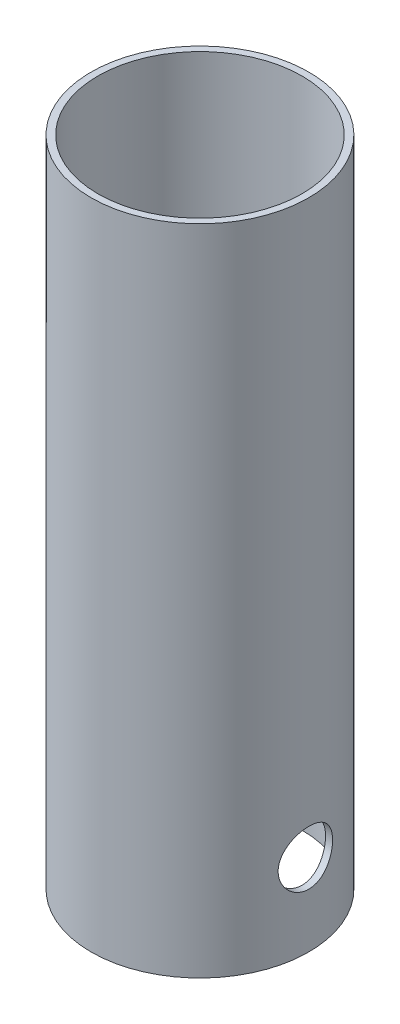
ISO-10303-21;
HEADER;
FILE_DESCRIPTION(('STEP AP214'),'2;1');
FILE_NAME('part.step','',(''),(''),'','','');
FILE_SCHEMA(('AUTOMOTIVE_DESIGN { 1 0 10303 214 1 1 1 1 }'));
ENDSEC;
DATA;
#1=APPLICATION_CONTEXT('core data for automotive mechanical design processes');
#2=APPLICATION_PROTOCOL_DEFINITION('international standard','automotive_design',2000,#1);
#3=PRODUCT_CONTEXT('',#1,'mechanical');
#4=PRODUCT('Part','Part','',(#3));
#5=PRODUCT_RELATED_PRODUCT_CATEGORY('part','',(#4));
#6=PRODUCT_DEFINITION_FORMATION('','',#4);
#7=PRODUCT_DEFINITION_CONTEXT('part definition',#1,'design');
#8=PRODUCT_DEFINITION('design','',#6,#7);
#9=PRODUCT_DEFINITION_SHAPE('','',#8);
#10=(LENGTH_UNIT() NAMED_UNIT(*) SI_UNIT(.MILLI.,.METRE.));
#11=(NAMED_UNIT(*) PLANE_ANGLE_UNIT() SI_UNIT($,.RADIAN.));
#12=(NAMED_UNIT(*) SI_UNIT($,.STERADIAN.) SOLID_ANGLE_UNIT());
#13=UNCERTAINTY_MEASURE_WITH_UNIT(LENGTH_MEASURE(1.E-05),#10,'distance_accuracy_value','');
#14=(GEOMETRIC_REPRESENTATION_CONTEXT(3) GLOBAL_UNCERTAINTY_ASSIGNED_CONTEXT((#13)) GLOBAL_UNIT_ASSIGNED_CONTEXT((#10,
#11,#12)) REPRESENTATION_CONTEXT('',''));
#15=CARTESIAN_POINT('',(0.,0.,0.));
#16=DIRECTION('',(0.,0.,1.));
#17=DIRECTION('',(1.,0.,0.));
#18=AXIS2_PLACEMENT_3D('',#15,#16,#17);
#19=CARTESIAN_POINT('',(0.,304.8,0.));
#20=DIRECTION('',(0.,-1.,0.));
#21=DIRECTION('',(0.,0.,-1.));
#22=AXIS2_PLACEMENT_3D('',#19,#20,#21);
#23=CYLINDRICAL_SURFACE('',#22,50.8);
#24=CARTESIAN_POINT('',(0.,304.8,0.));
#25=DIRECTION('',(0.,1.,0.));
#26=DIRECTION('',(0.,0.,1.));
#27=AXIS2_PLACEMENT_3D('',#24,#25,#26);
#28=CIRCLE('',#27,50.8);
#29=CARTESIAN_POINT('',(0.,304.8,50.8));
#30=VERTEX_POINT('',#29);
#31=EDGE_CURVE('E10',#30,#30,#28,.T.);
#32=ORIENTED_EDGE('',*,*,#31,.F.);
#33=EDGE_LOOP('',(#32));
#34=FACE_BOUND('',#33,.T.);
#35=CARTESIAN_POINT('',(0.,0.,0.));
#36=DIRECTION('',(0.,1.,0.));
#37=DIRECTION('',(0.,0.,1.));
#38=AXIS2_PLACEMENT_3D('',#35,#36,#37);
#39=CIRCLE('',#38,50.8);
#40=CARTESIAN_POINT('',(0.,0.,50.8));
#41=VERTEX_POINT('',#40);
#42=EDGE_CURVE('E44',#41,#41,#39,.T.);
#43=ORIENTED_EDGE('',*,*,#42,.T.);
#44=EDGE_LOOP('',(#43));
#45=FACE_BOUND('',#44,.T.);
#46=CARTESIAN_POINT('',(50.8,25.4,0.));
#47=CARTESIAN_POINT('',(50.7999991712333,25.4000014808444,-0.350871391860034));
#48=CARTESIAN_POINT('',(50.7963557889345,25.4145529083914,-0.701772516317838));
#49=CARTESIAN_POINT('',(50.7818809426384,25.4726405010329,-1.40104048403797));
#50=CARTESIAN_POINT('',(50.7710486585199,25.5161799731303,-1.74940703356745));
#51=CARTESIAN_POINT('',(50.7424895295911,25.6319052223682,-2.44124502263754));
#52=CARTESIAN_POINT('',(50.7247591873977,25.7041055312119,-2.78471388728348));
#53=CARTESIAN_POINT('',(50.6828935871675,25.8765516415089,-3.46412270465078));
#54=CARTESIAN_POINT('',(50.6587584928528,25.976796726068,-3.80006284958783));
#55=CARTESIAN_POINT('',(50.6047757406586,26.2043905326087,-4.46169451021718));
#56=CARTESIAN_POINT('',(50.5749350623246,26.3317061607503,-4.78739798722229));
#57=CARTESIAN_POINT('',(50.5103272300051,26.6125364293402,-5.42679543621999));
#58=CARTESIAN_POINT('',(50.4755600499304,26.7660512085315,-5.74048934460267));
#59=CARTESIAN_POINT('',(50.4020285790165,27.0981504495676,-6.35381147979076));
#60=CARTESIAN_POINT('',(50.3632643460531,27.2767345484323,-6.65343991016729));
#61=CARTESIAN_POINT('',(50.2827640986144,27.6577289740211,-7.2367349743611));
#62=CARTESIAN_POINT('',(50.2410279532313,27.8601403505552,-7.5204009040695));
#63=CARTESIAN_POINT('',(50.1548966889806,28.2913759349972,-8.0750581156447));
#64=CARTESIAN_POINT('',(50.1104666867623,28.5206191069139,-8.34571831903796));
#65=CARTESIAN_POINT('',(50.020881989898,29.0008641477497,-8.86686464210652));
#66=CARTESIAN_POINT('',(49.9757272866935,29.2518662737918,-9.11735052331669));
#67=CARTESIAN_POINT('',(49.8859289931922,29.774013811754,-9.59653750577761));
#68=CARTESIAN_POINT('',(49.8412854668862,30.0451617144521,-9.82523590526958));
#69=CARTESIAN_POINT('',(49.7537567109945,30.6058053123866,-10.2592748828875));
#70=CARTESIAN_POINT('',(49.7108714359826,30.8953005331093,-10.4646160647139));
#71=CARTESIAN_POINT('',(49.6274495248504,31.4952088921253,-10.8534044313296));
#72=CARTESIAN_POINT('',(49.5869574423395,31.8058695650575,-11.0364795147975));
#73=CARTESIAN_POINT('',(49.5102280325956,32.4420524126483,-11.3757455186293));
#74=CARTESIAN_POINT('',(49.4739907590757,32.7675747748501,-11.5319360996125));
#75=CARTESIAN_POINT('',(49.4068725050042,33.4311693111948,-11.8161875968753));
#76=CARTESIAN_POINT('',(49.375990858258,33.7692399180816,-11.944252012341));
#77=CARTESIAN_POINT('',(49.3205348605853,34.4555366388717,-12.1712162815549));
#78=CARTESIAN_POINT('',(49.2959603585794,34.8037625092967,-12.2701168338931));
#79=CARTESIAN_POINT('',(49.2543154217642,35.5007386966448,-12.436221348795));
#80=CARTESIAN_POINT('',(49.2371045464795,35.8493388151985,-12.5040204866511));
#81=CARTESIAN_POINT('',(49.210015019444,36.5512729679229,-12.6102115178838));
#82=CARTESIAN_POINT('',(49.2001362788037,36.9046069446509,-12.6486037677684));
#83=CARTESIAN_POINT('',(49.1880202031264,37.6133300613739,-12.6956394461546));
#84=CARTESIAN_POINT('',(49.1857817831568,37.9687189023965,-12.7042870984177));
#85=CARTESIAN_POINT('',(49.1890137301876,38.6789330651642,-12.691767865219));
#86=CARTESIAN_POINT('',(49.1944839899993,39.0337583946762,-12.6706013943201));
#87=CARTESIAN_POINT('',(49.2127364224763,39.7316073960973,-12.5995187524157));
#88=CARTESIAN_POINT('',(49.22533786105,40.0747084533623,-12.5503130079523));
#89=CARTESIAN_POINT('',(49.2573417276894,40.7554296627482,-12.4241103292504));
#90=CARTESIAN_POINT('',(49.2767440292335,41.0930499167103,-12.3471139120216));
#91=CARTESIAN_POINT('',(49.3217843433286,41.7605053161526,-12.1659479686147));
#92=CARTESIAN_POINT('',(49.3474226602481,42.0903400807747,-12.0617771160834));
#93=CARTESIAN_POINT('',(49.4041992420618,42.7400033848484,-11.8270732469111));
#94=CARTESIAN_POINT('',(49.4353375935764,43.0598317666152,-11.6965398150795));
#95=CARTESIAN_POINT('',(49.5025763638362,43.690562937089,-11.4086367411141));
#96=CARTESIAN_POINT('',(49.5387236163962,44.0013433300195,-11.2510099645166));
#97=CARTESIAN_POINT('',(49.6147222499585,44.6085650971434,-10.9109884297951));
#98=CARTESIAN_POINT('',(49.6545736446387,44.9050064183824,-10.7285935802116));
#99=CARTESIAN_POINT('',(49.7368912061636,45.4817227687305,-10.3402629377576));
#100=CARTESIAN_POINT('',(49.7793577545136,45.7619954275077,-10.1343237064006));
#101=CARTESIAN_POINT('',(49.8657540468829,46.3045828394129,-9.70028478733842));
#102=CARTESIAN_POINT('',(49.9096838191885,46.5668972450812,-9.47218467106647));
#103=CARTESIAN_POINT('',(49.9990956144951,47.0791412455607,-8.98847184260351));
#104=CARTESIAN_POINT('',(50.0445861548595,47.3285036662773,-8.73225969013431));
#105=CARTESIAN_POINT('',(50.134608462289,47.8048276343791,-8.19963228506236));
#106=CARTESIAN_POINT('',(50.179140210607,48.0317887440657,-7.92321663788773));
#107=CARTESIAN_POINT('',(50.2660084708923,48.4617544054244,-7.35199551908321));
#108=CARTESIAN_POINT('',(50.3083448968907,48.6647580193183,-7.05718932827454));
#109=CARTESIAN_POINT('',(50.3896420078925,49.0453458083086,-6.45115747378643));
#110=CARTESIAN_POINT('',(50.4286027134811,49.2229301384173,-6.13993191025174));
#111=CARTESIAN_POINT('',(50.5021857009727,49.5519242435077,-5.50205894817664));
#112=CARTESIAN_POINT('',(50.5367924694725,49.7032411142655,-5.1753618122226));
#113=CARTESIAN_POINT('',(50.6005250900631,49.9777512654891,-4.50983291281435));
#114=CARTESIAN_POINT('',(50.6296509113616,50.1009443879536,-4.17100108119895));
#115=CARTESIAN_POINT('',(50.6815804451279,50.3181720049987,-3.48369689795437));
#116=CARTESIAN_POINT('',(50.7043851415043,50.4122110378009,-3.13522605597325));
#117=CARTESIAN_POINT('',(50.7430158052577,50.5703465148879,-2.43117683531056));
#118=CARTESIAN_POINT('',(50.7588419446875,50.6344436973761,-2.07559863208339));
#119=CARTESIAN_POINT('',(50.7827431029274,50.7308795801196,-1.36919301852314));
#120=CARTESIAN_POINT('',(50.7910062049692,50.7639893989506,-1.01847707073284));
#121=CARTESIAN_POINT('',(50.800237198679,50.8009615432285,-0.31541336743784));
#122=CARTESIAN_POINT('',(50.8012052148024,50.8048243676347,0.0369343601257747));
#123=CARTESIAN_POINT('',(50.7958191948714,50.7832706554038,0.740645926180684));
#124=CARTESIAN_POINT('',(50.7894657659043,50.7578565463831,1.09200984382704));
#125=CARTESIAN_POINT('',(50.7696157024385,50.6779717279862,1.79121253860491));
#126=CARTESIAN_POINT('',(50.7561190958689,50.623501132218,2.13905132951393));
#127=CARTESIAN_POINT('',(50.7226101245245,50.4869883349046,2.82356306179158));
#128=CARTESIAN_POINT('',(50.702697527001,50.4053677184755,3.16032511359436));
#129=CARTESIAN_POINT('',(50.6568399111438,50.2150301012709,3.82567304882496));
#130=CARTESIAN_POINT('',(50.630894970696,50.1063134503419,4.15425903775662));
#131=CARTESIAN_POINT('',(50.5736595563104,49.862612838819,4.80108255615767));
#132=CARTESIAN_POINT('',(50.5423686884254,49.7276269423137,5.1193193209228));
#133=CARTESIAN_POINT('',(50.4752652454366,49.4323897300467,5.74335228440324));
#134=CARTESIAN_POINT('',(50.4394525868554,49.2721379478339,6.04914825330924));
#135=CARTESIAN_POINT('',(50.3635709449454,48.9244427345385,6.65165784868683));
#136=CARTESIAN_POINT('',(50.3234377307047,48.7365673976428,6.94811415662722));
#137=CARTESIAN_POINT('',(50.2405291461286,48.3371345740729,7.52422380225494));
#138=CARTESIAN_POINT('',(50.1977537501503,48.1255768575398,7.80387697681214));
#139=CARTESIAN_POINT('',(50.1106965473362,47.6801672244722,8.34464614432663));
#140=CARTESIAN_POINT('',(50.0664145124361,47.4463119229455,8.60575931219814));
#141=CARTESIAN_POINT('',(49.9775345625901,46.9578564600255,9.10774552124841));
#142=CARTESIAN_POINT('',(49.9329366440753,46.7032560639181,9.34861833336123));
#143=CARTESIAN_POINT('',(49.8435396380995,46.1684342909757,9.81423152077404));
#144=CARTESIAN_POINT('',(49.798762552455,45.8877369638548,10.0384298094841));
#145=CARTESIAN_POINT('',(49.7114180474332,45.3081305675814,10.4623983928031));
#146=CARTESIAN_POINT('',(49.6688506683881,45.0092211662326,10.6621682416265));
#147=CARTESIAN_POINT('',(49.5871654525083,44.3951999074534,11.0358331435241));
#148=CARTESIAN_POINT('',(49.5480475348876,44.0800884297478,11.2097288026349));
#149=CARTESIAN_POINT('',(49.4744221827737,43.4358078663221,11.5303347640473));
#150=CARTESIAN_POINT('',(49.4399146841434,43.1066389762436,11.6770454445395));
#151=CARTESIAN_POINT('',(49.3767472758478,42.4385568552869,11.941322821957));
#152=CARTESIAN_POINT('',(49.3480535235023,42.0997139390627,12.0590590982579));
#153=CARTESIAN_POINT('',(49.2971353347031,41.4128290431708,12.2655522066121));
#154=CARTESIAN_POINT('',(49.2749108891826,41.0647870763963,12.3543090792797));
#155=CARTESIAN_POINT('',(49.2376296473392,40.3621281676378,12.5020654961983));
#156=CARTESIAN_POINT('',(49.2225715358236,40.0075124445152,12.561070500742));
#157=CARTESIAN_POINT('',(49.2000953577878,39.2943190214301,12.6488212395504));
#158=CARTESIAN_POINT('',(49.1926771074559,38.9357414169985,12.6775677018221));
#159=CARTESIAN_POINT('',(49.185817071215,38.2277016124864,12.7041557199839));
#160=CARTESIAN_POINT('',(49.1861520762816,37.8782737577217,12.7028620982897));
#161=CARTESIAN_POINT('',(49.1942408132605,37.18080332814,12.6715008474905));
#162=CARTESIAN_POINT('',(49.2019943950572,36.8327607254354,12.6414338006184));
#163=CARTESIAN_POINT('',(49.2246856842026,36.1405766915761,12.5527847539515));
#164=CARTESIAN_POINT('',(49.2396232005249,35.796435156938,12.4942035123705));
#165=CARTESIAN_POINT('',(49.2762353693013,35.114482716169,12.3490170971842));
#166=CARTESIAN_POINT('',(49.2979100555285,34.7766718417825,12.2624117830954));
#167=CARTESIAN_POINT('',(49.3472093404805,34.1117220151869,12.0624812258991));
#168=CARTESIAN_POINT('',(49.3747975356246,33.7845312738811,11.9493190796123));
#169=CARTESIAN_POINT('',(49.4352104919493,33.1408966925127,11.6968711757633));
#170=CARTESIAN_POINT('',(49.4680352156121,32.8244527754727,11.5575856053645));
#171=CARTESIAN_POINT('',(49.5380063997145,32.2043218512767,11.253896671366));
#172=CARTESIAN_POINT('',(49.5751532777759,31.9006360807229,11.08949088008));
#173=CARTESIAN_POINT('',(49.6527498425637,31.3079530011093,10.7367145243406));
#174=CARTESIAN_POINT('',(49.6931996654691,31.0189562984709,10.5483429716106));
#175=CARTESIAN_POINT('',(49.7773998737371,30.4501161769564,10.1436809712847));
#176=CARTESIAN_POINT('',(49.8212088308342,30.1707081570843,9.92679043665087));
#177=CARTESIAN_POINT('',(49.9099422721471,29.6310449754774,9.4705676224956));
#178=CARTESIAN_POINT('',(49.9548667762613,29.3707901557157,9.23123494245163));
#179=CARTESIAN_POINT('',(50.0445985397535,28.8711179777936,8.73169734920666));
#180=CARTESIAN_POINT('',(50.0894057976671,28.6317008786965,8.47149217658717));
#181=CARTESIAN_POINT('',(50.1777009283588,28.1751897463363,7.93177910675604));
#182=CARTESIAN_POINT('',(50.2211882192745,27.9581054598087,7.65226286980275));
#183=CARTESIAN_POINT('',(50.3064080167936,27.5441260892629,7.07059087046114));
#184=CARTESIAN_POINT('',(50.3480942908494,27.3476694360361,6.76811606417608));
#185=CARTESIAN_POINT('',(50.4276548019764,26.9810799090292,6.14731636447359));
#186=CARTESIAN_POINT('',(50.4655307342998,26.8109353105372,5.8289986147784));
#187=CARTESIAN_POINT('',(50.5364004586039,26.4982345452317,5.17872119105971));
#188=CARTESIAN_POINT('',(50.5693961638392,26.3556675600479,4.84676692868837));
#189=CARTESIAN_POINT('',(50.6295721583139,26.0992026348734,4.17148182323261));
#190=CARTESIAN_POINT('',(50.6567533247305,25.9853003700849,3.82815270518897));
#191=CARTESIAN_POINT('',(50.7000132858145,25.8057979368553,3.19823683200796));
#192=CARTESIAN_POINT('',(50.71721910594,25.7351397987874,2.91315649544672));
#193=CARTESIAN_POINT('',(50.7469593206541,25.6137132702994,2.33855715066218));
#194=CARTESIAN_POINT('',(50.759494041119,25.5629434923679,2.04903845354596));
#195=CARTESIAN_POINT('',(50.7796492224325,25.4815876252073,1.46697993465224));
#196=CARTESIAN_POINT('',(50.7872692100114,25.4510034797697,1.17443982467946));
#197=CARTESIAN_POINT('',(50.7974442950098,25.4102116657456,0.587939844327169));
#198=CARTESIAN_POINT('',(50.8000006943887,25.3999987592629,0.293980358391877));
#199=CARTESIAN_POINT('',(50.8,25.4,0.));
#200=B_SPLINE_CURVE_WITH_KNOTS('',3,(#46,#47,#48,#49,#50,#51,#52,#53,#54,#55,#56,#57,#58,#59,
#60,#61,#62,#63,#64,#65,#66,#67,#68,#69,#70,#71,#72,#73,#74,#75,#76,#77,#78,#79,#80,#81,#82,#83,
#84,#85,#86,#87,#88,#89,#90,#91,#92,#93,#94,#95,#96,#97,#98,#99,#100,#101,#102,#103,#104,#105,
#106,#107,#108,#109,#110,#111,#112,#113,#114,#115,#116,#117,#118,#119,#120,#121,#122,#123,#124,
#125,#126,#127,#128,#129,#130,#131,#132,#133,#134,#135,#136,#137,#138,#139,#140,#141,#142,#143,
#144,#145,#146,#147,#148,#149,#150,#151,#152,#153,#154,#155,#156,#157,#158,#159,#160,#161,#162,
#163,#164,#165,#166,#167,#168,#169,#170,#171,#172,#173,#174,#175,#176,#177,#178,#179,#180,#181,
#182,#183,#184,#185,#186,#187,#188,#189,#190,#191,#192,#193,#194,#195,#196,#197,#198,#199),
.UNSPECIFIED.,.T.,.F.,(4,2,2,2,2,2,2,2,2,2,2,2,2,2,2,2,2,2,2,2,2,2,2,2,2,2,2,2,2,2,2,2,2,2,2,2,
2,2,2,2,2,2,2,2,2,2,2,2,2,2,2,2,2,2,2,2,2,2,2,2,2,2,2,2,2,2,2,2,2,2,2,2,2,2,2,2,4),(0.,
1.05234624346945,2.10481256086917,3.15781318586586,4.21078689601292,5.26248066800091,
6.314180009622,7.36586412519272,8.41759459443973,9.48875995810055,10.5599379813243,
11.6312486636515,12.7025316501414,13.7897879560629,14.8770579861276,15.9641926718257,
17.0513013142289,18.1166362841097,19.1819583384339,20.2471291097522,21.3122850701071,
22.3515824133506,23.3908604227986,24.4301891677163,25.4695342825529,26.5193512082967,
27.5691720107417,28.6191463282366,29.6691409551005,30.749104279285,31.8290887006652,
32.9091153823177,33.989135477451,35.0729008874254,36.1566723859189,37.2402750961568,
38.3238510892192,39.3796834211881,40.4354977404137,41.4912245187902,42.5469471694054,
43.5869874640297,44.6270143310167,45.6671178717933,46.7072406168912,47.7658131283218,
48.8243959150497,49.8831396616753,50.9418953887957,52.0266761501365,53.1114767042888,
54.196251845764,55.2810118949809,56.3592635004122,57.4375135946802,58.5155657280672,
59.5935919234102,60.6406223926115,61.6876316755096,62.7346131191635,63.7815998113718,
64.8223174281643,65.8630275889357,66.9038383904497,67.9446921258183,69.012696289142,
70.0807195166508,71.148756020385,72.2172566885489,73.305169077625,74.3925952848531,
75.4795940387079,76.5664286928594,77.44834870663,78.3302071822974,79.2121505648429,
80.09386715099),.UNSPECIFIED.);
#201=CARTESIAN_POINT('',(50.8,25.4,0.));
#202=VERTEX_POINT('',#201);
#203=EDGE_CURVE('E54',#202,#202,#200,.T.);
#204=ORIENTED_EDGE('',*,*,#203,.F.);
#205=EDGE_LOOP('',(#204));
#206=FACE_BOUND('',#205,.T.);
#207=ADVANCED_FACE('F31',(#34,#45,#206),#23,.T.);
#208=CARTESIAN_POINT('',(0.,304.8,0.));
#209=DIRECTION('',(0.,-1.,0.));
#210=DIRECTION('',(0.,0.,-1.));
#211=AXIS2_PLACEMENT_3D('',#208,#209,#210);
#212=CYLINDRICAL_SURFACE('',#211,47.625);
#213=CARTESIAN_POINT('',(0.,0.,0.));
#214=DIRECTION('',(0.,1.,0.));
#215=DIRECTION('',(0.,0.,1.));
#216=AXIS2_PLACEMENT_3D('',#213,#214,#215);
#217=CIRCLE('',#216,47.625);
#218=CARTESIAN_POINT('',(0.,0.,47.625));
#219=VERTEX_POINT('',#218);
#220=EDGE_CURVE('E51',#219,#219,#217,.T.);
#221=ORIENTED_EDGE('',*,*,#220,.F.);
#222=EDGE_LOOP('',(#221));
#223=FACE_BOUND('',#222,.T.);
#224=CARTESIAN_POINT('',(0.,304.8,0.));
#225=DIRECTION('',(0.,1.,0.));
#226=DIRECTION('',(0.,0.,1.));
#227=AXIS2_PLACEMENT_3D('',#224,#225,#226);
#228=CIRCLE('',#227,47.625);
#229=CARTESIAN_POINT('',(0.,304.8,47.625));
#230=VERTEX_POINT('',#229);
#231=EDGE_CURVE('E49',#230,#230,#228,.T.);
#232=ORIENTED_EDGE('',*,*,#231,.T.);
#233=EDGE_LOOP('',(#232));
#234=FACE_BOUND('',#233,.T.);
#235=CARTESIAN_POINT('',(45.900442535993,38.1,12.7));
#236=CARTESIAN_POINT('',(45.9004433753251,37.7501668357476,12.699998727167));
#237=CARTESIAN_POINT('',(45.9044528486738,37.4003093505592,12.6855329845805));
#238=CARTESIAN_POINT('',(45.9203695596393,36.7031434131365,12.627793341495));
#239=CARTESIAN_POINT('',(45.9322775357287,36.3558352023174,12.5845167473159));
#240=CARTESIAN_POINT('',(45.9636326456536,35.6661499473453,12.4695087162927));
#241=CARTESIAN_POINT('',(45.9830831324684,35.323775166624,12.3977646240576));
#242=CARTESIAN_POINT('',(46.0289339843067,34.6465543851171,12.2264349792985));
#243=CARTESIAN_POINT('',(46.0553342160743,34.3117082401093,12.1268499606006));
#244=CARTESIAN_POINT('',(46.1142587773997,33.6523113839474,11.9008138352313));
#245=CARTESIAN_POINT('',(46.1467743040132,33.3277466478549,11.7744013134764));
#246=CARTESIAN_POINT('',(46.2170137284818,32.6905619548832,11.4956042793671));
#247=CARTESIAN_POINT('',(46.2547376462459,32.3779420436688,11.3432196677338));
#248=CARTESIAN_POINT('',(46.3343241857379,31.766691066583,11.0136166280315));
#249=CARTESIAN_POINT('',(46.3761862699041,31.4680581911573,10.8364014242944));
#250=CARTESIAN_POINT('',(46.4629153744157,30.8864987267665,10.4582858445935));
#251=CARTESIAN_POINT('',(46.5077834604895,30.6035777739177,10.2573770490591));
#252=CARTESIAN_POINT('',(46.6003284541004,30.0491381662359,9.82848909309138));
#253=CARTESIAN_POINT('',(46.6480457929485,29.7780176886164,9.60000375906029));
#254=CARTESIAN_POINT('',(46.7440201307412,29.2558680893888,9.12122810525689));
#255=CARTESIAN_POINT('',(46.7922771362818,29.0048392136534,8.87093751871911));
#256=CARTESIAN_POINT('',(46.8880216752852,28.5244381073913,8.35009946091211));
#257=CARTESIAN_POINT('',(46.9355089907486,28.2950719265748,8.07954636856195));
#258=CARTESIAN_POINT('',(47.0283891862403,27.8596877254844,7.52007989004957));
#259=CARTESIAN_POINT('',(47.0737827925313,27.6536615723927,7.23117295438042));
#260=CARTESIAN_POINT('',(47.1619672597062,27.2631502786409,6.63194124111976));
#261=CARTESIAN_POINT('',(47.2047038624532,27.0790694223953,6.32134478160254));
#262=CARTESIAN_POINT('',(47.2855450695882,26.7377975699352,5.6851266717823));
#263=CARTESIAN_POINT('',(47.3236496094203,26.5806069484699,5.35950481216168));
#264=CARTESIAN_POINT('',(47.3941325942815,26.2943900406393,4.69555533434485));
#265=CARTESIAN_POINT('',(47.4265117851343,26.165360085356,4.35722937804418));
#266=CARTESIAN_POINT('',(47.4846130571243,25.9365254900323,3.67027840325549));
#267=CARTESIAN_POINT('',(47.5103353153119,25.8367200727157,3.32165365895277));
#268=CARTESIAN_POINT('',(47.5538666226843,25.6691512003179,2.62478016401492));
#269=CARTESIAN_POINT('',(47.5718434368499,25.6007061539759,2.27670572151941));
#270=CARTESIAN_POINT('',(47.600217089759,25.4931470910911,1.5757474086248));
#271=CARTESIAN_POINT('',(47.6106140333278,25.4540326689223,1.2228636048052));
#272=CARTESIAN_POINT('',(47.623531326378,25.4054870202205,0.514967692435199));
#273=CARTESIAN_POINT('',(47.6260528208849,25.3960514786212,0.159955900797415));
#274=CARTESIAN_POINT('',(47.6231503059244,25.4069369591472,-0.549575854092063));
#275=CARTESIAN_POINT('',(47.6177264096257,25.427257557446,-0.90409582427694));
#276=CARTESIAN_POINT('',(47.5993244182808,25.4965823365938,-1.60106088073403));
#277=CARTESIAN_POINT('',(47.5865406048655,25.5448489975603,-1.9435847695569));
#278=CARTESIAN_POINT('',(47.5539174306413,25.6690697729616,-2.62322426893063));
#279=CARTESIAN_POINT('',(47.5340782090768,25.7450233409725,-2.96033998607913));
#280=CARTESIAN_POINT('',(47.4878737004713,25.9239994129397,-3.62685633364968));
#281=CARTESIAN_POINT('',(47.4615081871182,26.0270228556045,-3.95625669609298));
#282=CARTESIAN_POINT('',(47.4029486572298,26.2593268088103,-4.60512915127636));
#283=CARTESIAN_POINT('',(47.3707545486427,26.3886077340429,-4.92460108712216));
#284=CARTESIAN_POINT('',(47.301035373617,26.6738619573257,-5.55464997788189));
#285=CARTESIAN_POINT('',(47.2634606115473,26.8300872220722,-5.86510731936137));
#286=CARTESIAN_POINT('',(47.1842159006326,27.1671855006563,-6.47178456843374));
#287=CARTESIAN_POINT('',(47.1425459376928,27.3480585993268,-6.76800442701928));
#288=CARTESIAN_POINT('',(47.0561937261027,27.7332280359162,-7.3443995433079));
#289=CARTESIAN_POINT('',(47.0115110243342,27.9375279004902,-7.62457237575423));
#290=CARTESIAN_POINT('',(46.9203004047879,28.3681840160222,-8.16711219720706));
#291=CARTESIAN_POINT('',(46.8737724052215,28.5945412452723,-8.42947839557425));
#292=CARTESIAN_POINT('',(46.7786438767993,29.075142370708,-8.94255336310013));
#293=CARTESIAN_POINT('',(46.7300235847542,29.3300292492109,-9.19265657239952));
#294=CARTESIAN_POINT('',(46.6334634215138,29.8600264249538,-9.67058265187394));
#295=CARTESIAN_POINT('',(46.5855235646997,30.1351371488741,-9.89840505173457));
#296=CARTESIAN_POINT('',(46.4916716175046,30.7038159180547,-10.3302438680608));
#297=CARTESIAN_POINT('',(46.4457597008375,30.9973855393084,-10.5342582475745));
#298=CARTESIAN_POINT('',(46.3572873502108,31.6010321284216,-10.9170111334863));
#299=CARTESIAN_POINT('',(46.3147267862002,31.9111084549457,-11.0957506209056));
#300=CARTESIAN_POINT('',(46.2339531637452,32.5476963751404,-11.4276669899786));
#301=CARTESIAN_POINT('',(46.1957688166623,32.874298259838,-11.5806778244637));
#302=CARTESIAN_POINT('',(46.125219032842,33.5398804917989,-11.8585564312674));
#303=CARTESIAN_POINT('',(46.0928536405134,33.8788609335084,-11.9834239888057));
#304=CARTESIAN_POINT('',(46.0349592187972,34.5666950340352,-12.2039404346735));
#305=CARTESIAN_POINT('',(46.0094287998314,34.9155466700277,-12.299595262629));
#306=CARTESIAN_POINT('',(45.9660127286187,35.6205903066363,-12.4608703156583));
#307=CARTESIAN_POINT('',(45.9481268428114,35.9767820826436,-12.526491458344));
#308=CARTESIAN_POINT('',(45.9209927293883,36.6830561931685,-12.6255933791389));
#309=CARTESIAN_POINT('',(45.9115022727705,37.0330028549346,-12.6599763136417));
#310=CARTESIAN_POINT('',(45.9005561669915,37.7346651510111,-12.6996061959163));
#311=CARTESIAN_POINT('',(45.8991003584085,38.0863807500839,-12.7048537217867));
#312=CARTESIAN_POINT('',(45.9042686314224,38.7889398279097,-12.6861671737487));
#313=CARTESIAN_POINT('',(45.9108919243986,39.1397833884349,-12.6622359480493));
#314=CARTESIAN_POINT('',(45.9320109934877,39.8380424477946,-12.5854111427906));
#315=CARTESIAN_POINT('',(45.9465067263898,40.1854579654346,-12.5325177222011));
#316=CARTESIAN_POINT('',(45.9825721855865,40.8676948799348,-12.3995289812215));
#317=CARTESIAN_POINT('',(46.0040002841505,41.2026299660445,-12.3199772110279));
#318=CARTESIAN_POINT('',(46.0533721826569,41.8644891889573,-12.13411599463));
#319=CARTESIAN_POINT('',(46.0813158766744,42.1914134558977,-12.027806983419));
#320=CARTESIAN_POINT('',(46.1429232257694,42.8351248252369,-11.7892503909313));
#321=CARTESIAN_POINT('',(46.1765873545884,43.1519110854659,-11.6570006612171));
#322=CARTESIAN_POINT('',(46.248695617452,43.7733130354664,-11.3675420607723));
#323=CARTESIAN_POINT('',(46.2871400016688,44.0779280871606,-11.2103318836304));
#324=CARTESIAN_POINT('',(46.3686461180573,44.6796291542874,-10.8683413679754));
#325=CARTESIAN_POINT('',(46.4117907024204,44.9764029717828,-10.6830314393192));
#326=CARTESIAN_POINT('',(46.5007778650214,45.5533875988715,-10.2887854157206));
#327=CARTESIAN_POINT('',(46.5466204750314,45.8335982133381,-10.0798490425257));
#328=CARTESIAN_POINT('',(46.639762874158,46.3757597258898,-9.63969604292716));
#329=CARTESIAN_POINT('',(46.6870629183847,46.6377074007379,-9.40847550064624));
#330=CARTESIAN_POINT('',(46.7818425813263,47.1416496780774,-8.92526947127515));
#331=CARTESIAN_POINT('',(46.8293221984267,47.3836444595015,-8.67328417043868));
#332=CARTESIAN_POINT('',(46.9245609249357,47.8528506089302,-8.14254043897337));
#333=CARTESIAN_POINT('',(46.9722883195761,48.0794310257956,-7.86321805022392));
#334=CARTESIAN_POINT('',(47.0652624055632,48.5082722873095,-7.28609063423102));
#335=CARTESIAN_POINT('',(47.1105090440775,48.7105326141234,-6.98828521364306));
#336=CARTESIAN_POINT('',(47.1972499441029,49.089256858834,-6.3761861461459));
#337=CARTESIAN_POINT('',(47.2387443176166,49.2657215468095,-6.06189299182691));
#338=CARTESIAN_POINT('',(47.3168089959716,49.5915104650214,-5.41895356068268));
#339=CARTESIAN_POINT('',(47.3533793812229,49.740835138475,-5.09030751835984));
#340=CARTESIAN_POINT('',(47.4202972335412,50.0101155838186,-4.42351020319017));
#341=CARTESIAN_POINT('',(47.4506898990664,50.1302860136768,-4.0854501951324));
#342=CARTESIAN_POINT('',(47.5047334560716,50.3417127617263,-3.39987380900163));
#343=CARTESIAN_POINT('',(47.5283843597102,50.432969132063,-3.05235744798407));
#344=CARTESIAN_POINT('',(47.5682595543607,50.5857573389556,-2.35049516565861));
#345=CARTESIAN_POINT('',(47.5844852151825,50.6472946582027,-1.99615051661401));
#346=CARTESIAN_POINT('',(47.6090440792706,50.7401132976272,-1.28325193917541));
#347=CARTESIAN_POINT('',(47.6173774830825,50.771395386603,-0.924698117972637));
#348=CARTESIAN_POINT('',(47.6257784311867,50.8029272510091,-0.21717405094931));
#349=CARTESIAN_POINT('',(47.6260918935284,50.8041002741226,0.131752460711908));
#350=CARTESIAN_POINT('',(47.619068278878,50.7777443449604,0.828436964846246));
#351=CARTESIAN_POINT('',(47.6117313689684,50.7502160195156,1.1761949826726));
#352=CARTESIAN_POINT('',(47.5896093151551,50.6666983047625,1.86801788156508));
#353=CARTESIAN_POINT('',(47.5748244865743,50.6107101203595,2.21208291835133));
#354=CARTESIAN_POINT('',(47.5382109349523,50.4707489826829,2.89408912180286));
#355=CARTESIAN_POINT('',(47.516382180484,50.3867759045516,3.23203026113866));
#356=CARTESIAN_POINT('',(47.4664459525155,50.1922138346998,3.89712572073426));
#357=CARTESIAN_POINT('',(47.43838298088,50.0818130793144,4.22433851026507));
#358=CARTESIAN_POINT('',(47.3766356100267,49.83495842091,4.86822711260058));
#359=CARTESIAN_POINT('',(47.342951256368,49.6985047290394,5.18490301077801));
#360=CARTESIAN_POINT('',(47.2708432054543,49.4005695398793,5.80565646674568));
#361=CARTESIAN_POINT('',(47.2324198600966,49.2390899006825,6.10973495772869));
#362=CARTESIAN_POINT('',(47.1518095729697,48.892172390115,6.70352904305508));
#363=CARTESIAN_POINT('',(47.1096211963974,48.7067253729269,6.99323909578351));
#364=CARTESIAN_POINT('',(47.0214314699798,48.3079954019515,7.56380319550918));
#365=CARTESIAN_POINT('',(46.9753590885048,48.0941094090415,7.84422497065173));
#366=CARTESIAN_POINT('',(46.8816221902652,47.6438135808568,8.38628843068945));
#367=CARTESIAN_POINT('',(46.8339569557503,47.4073935002183,8.64792147738422));
#368=CARTESIAN_POINT('',(46.7383284900756,46.913591670343,9.15067106406043));
#369=CARTESIAN_POINT('',(46.6903651863026,46.6562046123122,9.39178237618456));
#370=CARTESIAN_POINT('',(46.5954795866231,46.1222855186288,9.85175329169016));
#371=CARTESIAN_POINT('',(46.5485568402564,45.845761989618,10.0706226767123));
#372=CARTESIAN_POINT('',(46.4559951360038,45.2688022787065,10.4894316791626));
#373=CARTESIAN_POINT('',(46.4104087010158,44.9679684478294,10.688835565964));
#374=CARTESIAN_POINT('',(46.3230103173354,44.3501298462217,11.061463217469));
#375=CARTESIAN_POINT('',(46.2811969685392,44.0331311428066,11.234696709613));
#376=CARTESIAN_POINT('',(46.2025971231705,43.3851427716718,11.5536847685654));
#377=CARTESIAN_POINT('',(46.1658087748558,43.0541583169757,11.6994494653439));
#378=CARTESIAN_POINT('',(46.0983786205867,42.3804383580336,11.9623810694994));
#379=CARTESIAN_POINT('',(46.0677359780785,42.0377044605691,12.07955186955));
#380=CARTESIAN_POINT('',(46.0180003803258,41.3999428333906,12.2675212843544));
#381=CARTESIAN_POINT('',(45.9978376214548,41.1063016914722,12.3427725557624));
#382=CARTESIAN_POINT('',(45.962926123618,40.513990603769,12.4721510071352));
#383=CARTESIAN_POINT('',(45.9481787847971,40.2153193783133,12.5262727243287));
#384=CARTESIAN_POINT('',(45.9244466502384,39.6146674434796,12.6130032333122));
#385=CARTESIAN_POINT('',(45.9154613580143,39.3126870215194,12.6456138786093));
#386=CARTESIAN_POINT('',(45.9034598030889,38.7071435146417,12.6891096608622));
#387=CARTESIAN_POINT('',(45.900441807631,38.4035809148279,12.7000011045488));
#388=CARTESIAN_POINT('',(45.900442535993,38.1,12.7));
#389=B_SPLINE_CURVE_WITH_KNOTS('',3,(#235,#236,#237,#238,#239,#240,#241,#242,#243,#244,#245,
#246,#247,#248,#249,#250,#251,#252,#253,#254,#255,#256,#257,#258,#259,#260,#261,#262,#263,#264,
#265,#266,#267,#268,#269,#270,#271,#272,#273,#274,#275,#276,#277,#278,#279,#280,#281,#282,#283,
#284,#285,#286,#287,#288,#289,#290,#291,#292,#293,#294,#295,#296,#297,#298,#299,#300,#301,#302,
#303,#304,#305,#306,#307,#308,#309,#310,#311,#312,#313,#314,#315,#316,#317,#318,#319,#320,#321,
#322,#323,#324,#325,#326,#327,#328,#329,#330,#331,#332,#333,#334,#335,#336,#337,#338,#339,#340,
#341,#342,#343,#344,#345,#346,#347,#348,#349,#350,#351,#352,#353,#354,#355,#356,#357,#358,#359,
#360,#361,#362,#363,#364,#365,#366,#367,#368,#369,#370,#371,#372,#373,#374,#375,#376,#377,#378,
#379,#380,#381,#382,#383,#384,#385,#386,#387,#388),.UNSPECIFIED.,.T.,.F.,(4,2,2,2,2,2,2,2,2,2,2,
2,2,2,2,2,2,2,2,2,2,2,2,2,2,2,2,2,2,2,2,2,2,2,2,2,2,2,2,2,2,2,2,2,2,2,2,2,2,2,2,2,2,2,2,2,2,2,2,
2,2,2,2,2,2,2,2,2,2,2,2,2,2,2,2,2,4),(0.,1.04922095670322,2.09854002444258,3.1483260966176,
4.19809204141609,5.24635826041543,6.29462848652916,7.34276271732528,8.39127053364622,
9.46330006826684,10.5353427199392,11.6076838796239,12.6796502258812,13.7690299198013,
14.8584247943639,15.9476776520609,17.0369015365971,18.1011754818671,19.1654347085516,
20.2295391935047,21.2936285222171,22.3308387155314,23.3680284397588,24.4052541356165,
25.4424962139415,26.4900234531826,27.5375542978958,28.5852430449892,29.6329782805268,
30.7128940513882,31.7928326127314,32.8728635031555,33.9528524616834,35.0395641058805,
36.1262840432238,37.212782877854,38.2992485147367,39.3532355500075,40.4072016722135,
41.4610649224565,42.5149223882345,43.5484818052467,44.5820244207335,45.6156526714766,
46.6493350394027,47.7057152057547,48.7621078145629,49.8186863972158,50.8752555037047,
51.962417968909,53.0496035783745,54.1367567253845,55.2238921167548,56.3027620974472,
57.3816301324246,58.460299057347,59.5389405721075,60.5844663579519,61.6299693102308,
62.6754280027293,63.7208913597136,64.7591188665968,65.7973379594316,66.8354800048771,
67.8740193756842,68.9398278860128,70.0061233103323,71.0726895625926,72.1387847076267,
73.2288302443103,74.3184696128486,75.4077063533192,76.496794726065,77.4074034861802,
78.318247516685,79.2290130538263,80.1395140881502),.UNSPECIFIED.);
#390=CARTESIAN_POINT('',(45.900442535993,38.1,12.7));
#391=VERTEX_POINT('',#390);
#392=EDGE_CURVE('E35',#391,#391,#389,.T.);
#393=ORIENTED_EDGE('',*,*,#392,.T.);
#394=EDGE_LOOP('',(#393));
#395=FACE_BOUND('',#394,.T.);
#396=ADVANCED_FACE('F66',(#223,#234,#395),#212,.F.);
#397=CARTESIAN_POINT('',(0.,304.8,0.));
#398=DIRECTION('',(0.,1.,0.));
#399=DIRECTION('',(0.,0.,1.));
#400=AXIS2_PLACEMENT_3D('',#397,#398,#399);
#401=PLANE('',#400);
#402=ORIENTED_EDGE('',*,*,#31,.T.);
#403=EDGE_LOOP('',(#402));
#404=FACE_BOUND('',#403,.T.);
#405=ORIENTED_EDGE('',*,*,#231,.F.);
#406=EDGE_LOOP('',(#405));
#407=FACE_BOUND('',#406,.T.);
#408=ADVANCED_FACE('F71',(#404,#407),#401,.T.);
#409=CARTESIAN_POINT('',(0.,0.,0.));
#410=DIRECTION('',(0.,1.,0.));
#411=DIRECTION('',(0.,0.,1.));
#412=AXIS2_PLACEMENT_3D('',#409,#410,#411);
#413=PLANE('',#412);
#414=ORIENTED_EDGE('',*,*,#42,.F.);
#415=EDGE_LOOP('',(#414));
#416=FACE_BOUND('',#415,.T.);
#417=ORIENTED_EDGE('',*,*,#220,.T.);
#418=EDGE_LOOP('',(#417));
#419=FACE_BOUND('',#418,.T.);
#420=ADVANCED_FACE('F64',(#416,#419),#413,.F.);
#421=CARTESIAN_POINT('',(50.8,38.1,0.));
#422=DIRECTION('',(-1.,0.,0.));
#423=DIRECTION('',(0.,0.,1.));
#424=AXIS2_PLACEMENT_3D('',#421,#422,#423);
#425=CYLINDRICAL_SURFACE('',#424,12.7);
#426=ORIENTED_EDGE('',*,*,#392,.F.);
#427=EDGE_LOOP('',(#426));
#428=FACE_BOUND('',#427,.T.);
#429=ORIENTED_EDGE('',*,*,#203,.T.);
#430=EDGE_LOOP('',(#429));
#431=FACE_BOUND('',#430,.T.);
#432=ADVANCED_FACE('F61',(#428,#431),#425,.F.);
#433=CLOSED_SHELL('',(#207,#396,#408,#420,#432));
#434=MANIFOLD_SOLID_BREP('B2',#433);
#435=ADVANCED_BREP_SHAPE_REPRESENTATION('',(#18,#434),#14);
#436=SHAPE_DEFINITION_REPRESENTATION(#9,#435);
ENDSEC;
END-ISO-10303-21;
